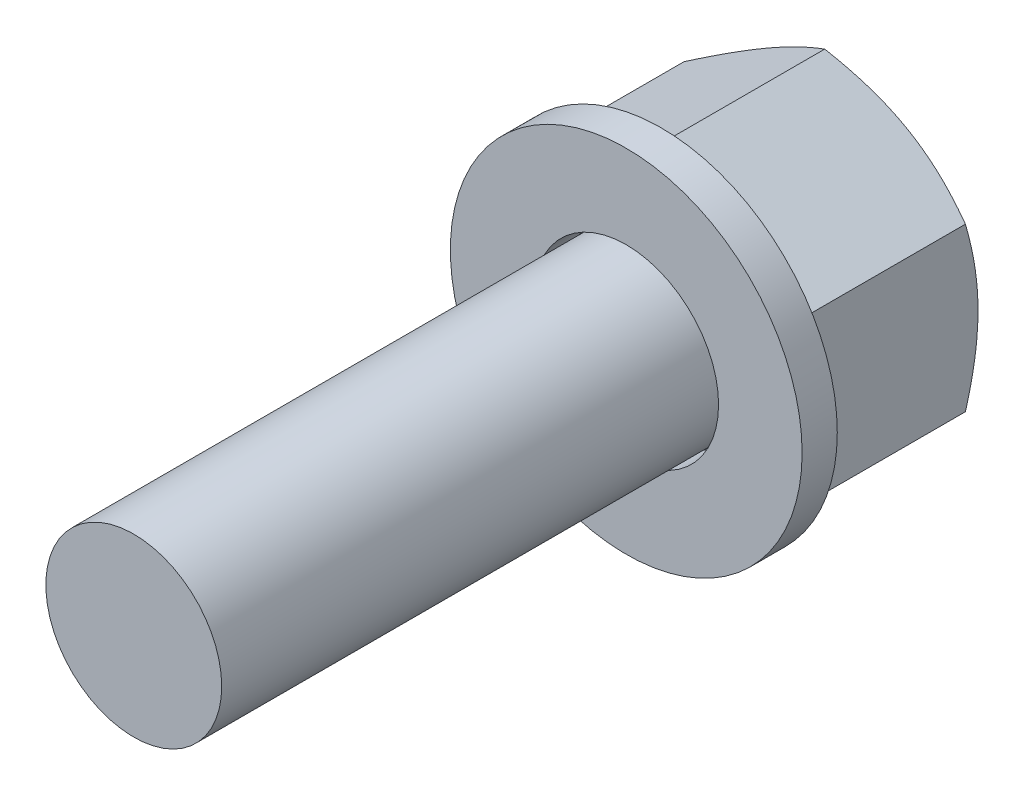
ISO-10303-21;
HEADER;
FILE_DESCRIPTION(('STEP AP214'),'2;1');
FILE_NAME('part.step','',(''),(''),'','','');
FILE_SCHEMA(('AUTOMOTIVE_DESIGN { 1 0 10303 214 1 1 1 1 }'));
ENDSEC;
DATA;
#1=APPLICATION_CONTEXT('core data for automotive mechanical design processes');
#2=APPLICATION_PROTOCOL_DEFINITION('international standard','automotive_design',2000,#1);
#3=PRODUCT_CONTEXT('',#1,'mechanical');
#4=PRODUCT('Part','Part','',(#3));
#5=PRODUCT_RELATED_PRODUCT_CATEGORY('part','',(#4));
#6=PRODUCT_DEFINITION_FORMATION('','',#4);
#7=PRODUCT_DEFINITION_CONTEXT('part definition',#1,'design');
#8=PRODUCT_DEFINITION('design','',#6,#7);
#9=PRODUCT_DEFINITION_SHAPE('','',#8);
#10=(LENGTH_UNIT() NAMED_UNIT(*) SI_UNIT(.MILLI.,.METRE.));
#11=(NAMED_UNIT(*) PLANE_ANGLE_UNIT() SI_UNIT($,.RADIAN.));
#12=(NAMED_UNIT(*) SI_UNIT($,.STERADIAN.) SOLID_ANGLE_UNIT());
#13=UNCERTAINTY_MEASURE_WITH_UNIT(LENGTH_MEASURE(1.E-05),#10,'distance_accuracy_value','');
#14=(GEOMETRIC_REPRESENTATION_CONTEXT(3) GLOBAL_UNCERTAINTY_ASSIGNED_CONTEXT((#13)) GLOBAL_UNIT_ASSIGNED_CONTEXT((#10,
#11,#12)) REPRESENTATION_CONTEXT('',''));
#15=CARTESIAN_POINT('',(0.,0.,0.));
#16=DIRECTION('',(0.,0.,1.));
#17=DIRECTION('',(1.,0.,0.));
#18=AXIS2_PLACEMENT_3D('',#15,#16,#17);
#19=CARTESIAN_POINT('',(-11.1632104785927,7.53610294902704,12.));
#20=DIRECTION('',(0.,0.,1.));
#21=DIRECTION('',(1.,0.,0.));
#22=AXIS2_PLACEMENT_3D('',#19,#20,#21);
#23=PLANE('',#22);
#24=CARTESIAN_POINT('',(-11.1632104785927,7.53610294902704,12.));
#25=DIRECTION('',(0.,0.,1.));
#26=DIRECTION('',(1.,0.,0.));
#27=AXIS2_PLACEMENT_3D('',#24,#25,#26);
#28=CIRCLE('',#27,10.);
#29=CARTESIAN_POINT('',(-1.16321047859271,7.53610294902704,12.));
#30=VERTEX_POINT('',#29);
#31=EDGE_CURVE('E11',#30,#30,#28,.T.);
#32=ORIENTED_EDGE('',*,*,#31,.T.);
#33=EDGE_LOOP('',(#32));
#34=FACE_BOUND('',#33,.T.);
#35=CARTESIAN_POINT('',(-11.1632104785927,7.53610294902704,12.));
#36=DIRECTION('',(0.,0.,1.));
#37=DIRECTION('',(1.,0.,0.));
#38=AXIS2_PLACEMENT_3D('',#35,#36,#37);
#39=CIRCLE('',#38,5.25);
#40=CARTESIAN_POINT('',(-5.91321047859271,7.53610294902704,12.));
#41=VERTEX_POINT('',#40);
#42=EDGE_CURVE('E60',#41,#41,#39,.T.);
#43=ORIENTED_EDGE('',*,*,#42,.F.);
#44=EDGE_LOOP('',(#43));
#45=FACE_BOUND('',#44,.T.);
#46=ADVANCED_FACE('F49',(#34,#45),#23,.T.);
#47=CARTESIAN_POINT('',(-11.1632104785927,7.53610294902704,10.));
#48=DIRECTION('',(0.,0.,1.));
#49=DIRECTION('',(1.,0.,0.));
#50=AXIS2_PLACEMENT_3D('',#47,#48,#49);
#51=PLANE('',#50);
#52=CARTESIAN_POINT('',(-11.1632104785927,7.53610294902704,10.));
#53=DIRECTION('',(0.,0.,1.));
#54=DIRECTION('',(1.,0.,0.));
#55=AXIS2_PLACEMENT_3D('',#52,#53,#54);
#56=CIRCLE('',#55,10.);
#57=CARTESIAN_POINT('',(-1.16321047859271,7.53610294902704,10.));
#58=VERTEX_POINT('',#57);
#59=EDGE_CURVE('E53',#58,#58,#56,.T.);
#60=ORIENTED_EDGE('',*,*,#59,.F.);
#61=EDGE_LOOP('',(#60));
#62=FACE_BOUND('',#61,.T.);
#63=CARTESIAN_POINT('',(-11.1632104785927,7.53610294902704,10.));
#64=DIRECTION('',(0.,0.,1.));
#65=DIRECTION('',(1.,0.,0.));
#66=AXIS2_PLACEMENT_3D('',#63,#64,#65);
#67=CIRCLE('',#66,5.25);
#68=CARTESIAN_POINT('',(-5.91321047859271,7.53610294902704,10.));
#69=VERTEX_POINT('',#68);
#70=EDGE_CURVE('E62',#69,#69,#67,.T.);
#71=ORIENTED_EDGE('',*,*,#70,.T.);
#72=EDGE_LOOP('',(#71));
#73=FACE_BOUND('',#72,.T.);
#74=ADVANCED_FACE('F72',(#62,#73),#51,.F.);
#75=CARTESIAN_POINT('',(-11.1632104785927,7.53610294902704,12.));
#76=DIRECTION('',(0.,0.,-1.));
#77=DIRECTION('',(-1.,0.,0.));
#78=AXIS2_PLACEMENT_3D('',#75,#76,#77);
#79=CYLINDRICAL_SURFACE('',#78,10.);
#80=ORIENTED_EDGE('',*,*,#31,.F.);
#81=EDGE_LOOP('',(#80));
#82=FACE_BOUND('',#81,.T.);
#83=ORIENTED_EDGE('',*,*,#59,.T.);
#84=EDGE_LOOP('',(#83));
#85=FACE_BOUND('',#84,.T.);
#86=ADVANCED_FACE('F51',(#82,#85),#79,.T.);
#87=CARTESIAN_POINT('',(-11.1632104785927,7.53610294902704,12.));
#88=DIRECTION('',(0.,0.,-1.));
#89=DIRECTION('',(-1.,0.,0.));
#90=AXIS2_PLACEMENT_3D('',#87,#88,#89);
#91=CYLINDRICAL_SURFACE('',#90,5.25);
#92=ORIENTED_EDGE('',*,*,#42,.T.);
#93=EDGE_LOOP('',(#92));
#94=FACE_BOUND('',#93,.T.);
#95=ORIENTED_EDGE('',*,*,#70,.F.);
#96=EDGE_LOOP('',(#95));
#97=FACE_BOUND('',#96,.T.);
#98=ADVANCED_FACE('F68',(#94,#97),#91,.F.);
#99=CLOSED_SHELL('',(#46,#74,#86,#98));
#100=MANIFOLD_SOLID_BREP('B2',#99);
#101=CARTESIAN_POINT('',(-2.0540309193443,3.55768591262174,10.));
#102=DIRECTION('',(-0.5,0.866025403784439,0.));
#103=DIRECTION('',(-0.866025403784439,-0.5,0.));
#104=AXIS2_PLACEMENT_3D('',#101,#102,#103);
#105=PLANE('',#104);
#106=CARTESIAN_POINT('',(-3.16301047859271,2.91741626556387,0.714597847732983));
#107=CARTESIAN_POINT('',(-3.33885926247261,2.81588992285415,0.655990714047307));
#108=CARTESIAN_POINT('',(-3.51536367289885,2.7139850539814,0.600043401047298));
#109=CARTESIAN_POINT('',(-3.86980594147117,2.50934771480899,0.494201005024673));
#110=CARTESIAN_POINT('',(-4.04774438328543,2.40661490752835,0.444308534431073));
#111=CARTESIAN_POINT('',(-4.58440871621536,2.09677161044678,0.304692797206872));
#112=CARTESIAN_POINT('',(-4.94525306082844,1.88843803094886,0.225281170978374));
#113=CARTESIAN_POINT('',(-5.48524964879677,1.57667085552387,0.132161646294492));
#114=CARTESIAN_POINT('',(-5.662788668236,1.47416865485897,0.105634581029127));
#115=CARTESIAN_POINT('',(-6.01866959155292,1.26870070798249,0.0611531748588778));
#116=CARTESIAN_POINT('',(-6.19701142308596,1.16573500353912,0.0431980765145818));
#117=CARTESIAN_POINT('',(-6.55400216341631,0.959626303511187,0.0163156484918668));
#118=CARTESIAN_POINT('',(-6.73265049220222,0.856483642796366,0.00737807354623517));
#119=CARTESIAN_POINT('',(-7.0901121836901,0.650103038990858,-0.00127769603486791));
#120=CARTESIAN_POINT('',(-7.26892554112279,0.546865098942398,-0.000996175497148033));
#121=CARTESIAN_POINT('',(-7.60322384560962,0.353857882857286,0.00814502526877787));
#122=CARTESIAN_POINT('',(-7.75873238293139,0.264074986973279,0.015889604367372));
#123=CARTESIAN_POINT('',(-8.06938524033323,0.0847194761278015,0.0382011348534302));
#124=CARTESIAN_POINT('',(-8.22452953515272,-0.00485312424946415,0.0527685461381488));
#125=CARTESIAN_POINT('',(-8.68936179448754,-0.273224154304442,0.106360690527536));
#126=CARTESIAN_POINT('',(-8.99822696577444,-0.451547544090235,0.155268641669145));
#127=CARTESIAN_POINT('',(-9.61923370735301,-0.810085953509199,0.277539403234315));
#128=CARTESIAN_POINT('',(-9.93129602070719,-0.990255214128171,0.351420520376001));
#129=CARTESIAN_POINT('',(-10.5507669602875,-1.34790692785,0.519100141254974));
#130=CARTESIAN_POINT('',(-10.8581835194845,-1.52539396105573,0.612859260854458));
#131=CARTESIAN_POINT('',(-11.1634104785927,-1.7016168280608,0.714597847732978));
#132=B_SPLINE_CURVE_WITH_KNOTS('',3,(#106,#107,#108,#109,#110,#111,#112,#113,#114,#115,#116,
#117,#118,#119,#120,#121,#122,#123,#124,#125,#126,#127,#128,#129,#130,#131),.UNSPECIFIED.,.F.,
.F.,(4,2,2,2,2,2,2,2,2,2,2,2,4),(0.,0.633973543721352,1.26821965714356,2.53934712434766,
3.15934343977049,3.77928496069784,4.39852133866767,5.01773858515596,5.55680239410249,
6.09590254421148,7.17487077411835,8.27776850154292,9.37850115249054),.UNSPECIFIED.);
#133=CARTESIAN_POINT('',(-3.16321047859271,2.91730079551004,0.714531179816332));
#134=VERTEX_POINT('',#133);
#135=CARTESIAN_POINT('',(-7.16321047859272,0.60789971875153,0.));
#136=VERTEX_POINT('',#135);
#137=EDGE_CURVE('E192',#134,#136,#132,.T.);
#138=ORIENTED_EDGE('',*,*,#137,.F.);
#139=DIRECTION('',(0.,0.,-1.));
#140=VECTOR('',#139,1.);
#141=CARTESIAN_POINT('',(-3.16321047859271,2.91730079551004,10.));
#142=LINE('',#141,#140);
#143=CARTESIAN_POINT('',(-3.16321047859271,2.91730079551004,10.));
#144=VERTEX_POINT('',#143);
#145=EDGE_CURVE('E209',#144,#134,#142,.T.);
#146=ORIENTED_EDGE('',*,*,#145,.F.);
#147=DIRECTION('',(0.866025403784439,0.5,0.));
#148=VECTOR('',#147,1.);
#149=CARTESIAN_POINT('',(-2.0540309193443,3.55768591262174,10.));
#150=LINE('',#149,#148);
#151=CARTESIAN_POINT('',(-11.1632104785927,-1.70150135800697,10.));
#152=VERTEX_POINT('',#151);
#153=EDGE_CURVE('E262',#152,#144,#150,.T.);
#154=ORIENTED_EDGE('',*,*,#153,.F.);
#155=DIRECTION('',(0.,0.,-1.));
#156=VECTOR('',#155,1.);
#157=CARTESIAN_POINT('',(-11.1632104785927,-1.70150135800697,10.));
#158=LINE('',#157,#156);
#159=CARTESIAN_POINT('',(-11.1632104785927,-1.70150135800697,0.714531179816329));
#160=VERTEX_POINT('',#159);
#161=EDGE_CURVE('E277',#152,#160,#158,.T.);
#162=ORIENTED_EDGE('',*,*,#161,.T.);
#163=EDGE_CURVE('E298',#136,#160,#132,.T.);
#164=ORIENTED_EDGE('',*,*,#163,.F.);
#165=EDGE_LOOP('',(#138,#146,#154,#162,#164));
#166=FACE_BOUND('',#165,.T.);
#167=ADVANCED_FACE('F110',(#166),#105,.F.);
#168=CARTESIAN_POINT('',(-3.16321047859271,0.,10.));
#169=DIRECTION('',(-1.,0.,0.));
#170=DIRECTION('',(0.,0.,1.));
#171=AXIS2_PLACEMENT_3D('',#168,#169,#170);
#172=PLANE('',#171);
#173=CARTESIAN_POINT('',(-3.16321047859271,-4.97682620943437,3.95583867714707));
#174=CARTESIAN_POINT('',(-3.16321047859271,-4.62646107555689,3.78545562620078));
#175=CARTESIAN_POINT('',(-3.16321047859271,-4.27530289010461,3.61667599394854));
#176=CARTESIAN_POINT('',(-3.16321047859271,-3.57097896554717,3.2832234371504));
#177=CARTESIAN_POINT('',(-3.16321047859271,-3.21781292977735,3.11855113991346));
#178=CARTESIAN_POINT('',(-3.16321047859271,-2.50728328800546,2.79340753111619));
#179=CARTESIAN_POINT('',(-3.16321047859271,-2.14990735946823,2.63296305642341));
#180=CARTESIAN_POINT('',(-3.16321047859271,-1.43234952569936,2.31850098427352));
#181=CARTESIAN_POINT('',(-3.16321047859271,-1.0721677510108,2.16448308991153));
#182=CARTESIAN_POINT('',(-3.16321047859271,-0.336495143481326,1.85962396171519));
#183=CARTESIAN_POINT('',(-3.16321047859271,0.0391090129986439,1.70905471064825));
#184=CARTESIAN_POINT('',(-3.16321047859271,0.794671012477403,1.4190566418621));
#185=CARTESIAN_POINT('',(-3.16321047859271,1.17462933272836,1.27962905897736));
#186=CARTESIAN_POINT('',(-3.16321047859271,1.93883180449096,1.01549651955411));
#187=CARTESIAN_POINT('',(-3.16321047859271,2.32306586686865,0.89076268123599));
#188=CARTESIAN_POINT('',(-3.16321047859271,3.09703073594591,0.659947891390958));
#189=CARTESIAN_POINT('',(-3.16321047859271,3.48675980449369,0.5538611784085));
#190=CARTESIAN_POINT('',(-3.16321047859271,4.269866719254,0.365924175439379));
#191=CARTESIAN_POINT('',(-3.16321047859271,4.66321194450826,0.283941586460917));
#192=CARTESIAN_POINT('',(-3.16321047859271,5.2568947171314,0.182551501549597));
#193=CARTESIAN_POINT('',(-3.16321047859271,5.45541327671288,0.152350800716321));
#194=CARTESIAN_POINT('',(-3.16321047859271,5.85347286144641,0.0997336052582475));
#195=CARTESIAN_POINT('',(-3.16321047859271,6.05301378556852,0.0773163559748541));
#196=CARTESIAN_POINT('',(-3.16321047859271,6.45019614805782,0.0409996259359649));
#197=CARTESIAN_POINT('',(-3.16321047859271,6.64782754817885,0.0269908135266279));
#198=CARTESIAN_POINT('',(-3.16321047859271,7.04350600835748,0.0073483726413162));
#199=CARTESIAN_POINT('',(-3.16321047859271,7.24155306130159,0.00171460198648287));
#200=CARTESIAN_POINT('',(-3.16321047859271,7.63770952038498,-0.0010429673494914));
#201=CARTESIAN_POINT('',(-3.16321047859271,7.83581892699747,0.001833300192532));
#202=CARTESIAN_POINT('',(-3.16321047859271,8.23173764263204,0.0160242569427389));
#203=CARTESIAN_POINT('',(-3.16321047859271,8.42954693690987,0.0273393480972802));
#204=CARTESIAN_POINT('',(-3.16321047859271,8.90167009585454,0.0641744778736273));
#205=CARTESIAN_POINT('',(-3.16321047859271,9.17569236972895,0.0935162888707967));
#206=CARTESIAN_POINT('',(-3.16321047859271,9.72176022753417,0.166817992454415));
#207=CARTESIAN_POINT('',(-3.16321047859271,9.99380555085057,0.210779777858929));
#208=CARTESIAN_POINT('',(-3.16321047859271,10.806625293464,0.362268610049229));
#209=CARTESIAN_POINT('',(-3.16321047859271,11.3438022362609,0.489374232972776));
#210=CARTESIAN_POINT('',(-3.16321047859271,12.147344764835,0.710560343034664));
#211=CARTESIAN_POINT('',(-3.16321047859271,12.4178547243446,0.790456740492547));
#212=CARTESIAN_POINT('',(-3.16321047859271,12.9562482384914,0.958735317999197));
#213=CARTESIAN_POINT('',(-3.16321047859271,13.2241317736444,1.04711756094802));
#214=CARTESIAN_POINT('',(-3.16321047859271,13.7573558093438,1.23093400072742));
#215=CARTESIAN_POINT('',(-3.16321047859271,14.0226970489688,1.32636607318942));
#216=CARTESIAN_POINT('',(-3.16321047859271,14.5511658268171,1.5231404013429));
#217=CARTESIAN_POINT('',(-3.16321047859271,14.8142934095011,1.62448253800637));
#218=CARTESIAN_POINT('',(-3.16321047859271,15.5036822763205,1.89747002443615));
#219=CARTESIAN_POINT('',(-3.16321047859271,15.928325027106,2.07319821098395));
#220=CARTESIAN_POINT('',(-3.16321047859271,16.773413945882,2.43450500202877));
#221=CARTESIAN_POINT('',(-3.16321047859271,17.1938596989216,2.62008456927881));
#222=CARTESIAN_POINT('',(-3.16321047859271,18.0314810660595,2.99883432595372));
#223=CARTESIAN_POINT('',(-3.16321047859271,18.4486555088375,3.1920070975434));
#224=CARTESIAN_POINT('',(-3.16321047859271,19.2802271333456,3.58418474211925));
#225=CARTESIAN_POINT('',(-3.16321047859271,19.6946244131227,3.78318940786502));
#226=CARTESIAN_POINT('',(-3.16321047859271,20.521786035865,4.18609465848904));
#227=CARTESIAN_POINT('',(-3.16321047859271,20.934547056624,4.39000205005959));
#228=CARTESIAN_POINT('',(-3.16321047859271,21.7582295738011,4.8015003999014));
#229=CARTESIAN_POINT('',(-3.16321047859271,22.1691510568904,5.00909138480925));
#230=CARTESIAN_POINT('',(-3.16321047859271,22.9893929493316,5.42721038320668));
#231=CARTESIAN_POINT('',(-3.16321047859271,23.3987136591581,5.6377378079254));
#232=CARTESIAN_POINT('',(-3.16321047859271,24.2160906622184,6.06123442899081));
#233=CARTESIAN_POINT('',(-3.16321047859271,24.624146950439,6.27420363500302));
#234=CARTESIAN_POINT('',(-3.16321047859271,25.7644142952693,6.87290664968607));
#235=CARTESIAN_POINT('',(-3.16321047859271,26.4954463236679,7.26088561150215));
#236=CARTESIAN_POINT('',(-3.16321047859271,27.9550154922266,8.04159320516506));
#237=CARTESIAN_POINT('',(-3.16321047859271,28.6835524931106,8.43432209678816));
#238=CARTESIAN_POINT('',(-3.16321047859271,30.1364115194762,9.22210229728399));
#239=CARTESIAN_POINT('',(-3.16321047859271,30.8607395975913,9.61714245087919));
#240=CARTESIAN_POINT('',(-3.16321047859271,31.9460847341197,10.2117322144822));
#241=CARTESIAN_POINT('',(-3.16321047859271,32.3076623828794,10.4102599275219));
#242=CARTESIAN_POINT('',(-3.16321047859271,33.0304833920339,10.8079218150819));
#243=CARTESIAN_POINT('',(-3.16321047859271,33.391726752903,11.0070559887402));
#244=CARTESIAN_POINT('',(-3.16321047859271,33.7528231671495,11.2064563382666));
#245=B_SPLINE_CURVE_WITH_KNOTS('',3,(#173,#174,#175,#176,#177,#178,#179,#180,#181,#182,#183,
#184,#185,#186,#187,#188,#189,#190,#191,#192,#193,#194,#195,#196,#197,#198,#199,#200,#201,#202,
#203,#204,#205,#206,#207,#208,#209,#210,#211,#212,#213,#214,#215,#216,#217,#218,#219,#220,#221,
#222,#223,#224,#225,#226,#227,#228,#229,#230,#231,#232,#233,#234,#235,#236,#237,#238,#239,#240,
#241,#242,#243,#244),.UNSPECIFIED.,.F.,.F.,(4,2,2,2,2,2,2,2,2,2,2,2,2,2,2,2,2,2,2,2,2,2,2,2,2,2,
2,2,2,2,2,2,2,2,2,4),(0.,1.16880588047795,2.3377891917305,3.51295749611108,4.68807144803918,
5.90191370960454,7.11589031562683,8.32743946232026,9.53861361267913,10.7430103426782,
11.3452897554481,11.9475107568131,12.5417214039076,13.1359219632724,13.7301271465819,
14.3243606340572,15.1506623887472,15.9770711647035,17.6307319451341,18.4768449347359,
19.3229641965072,20.1688295238942,21.014677821533,22.3931966367318,23.7718504203478,
25.1509771588064,26.5300549483226,27.9111726944925,29.2923004317938,30.6731551171407,
32.0540152703407,34.5368130414091,37.0197472176366,39.4948897838097,40.7323726306587,
41.969853719233),.UNSPECIFIED.);
#246=CARTESIAN_POINT('',(-3.16321047859271,12.1549051025441,0.714531179816331));
#247=VERTEX_POINT('',#246);
#248=CARTESIAN_POINT('',(-3.16321047859271,7.53610294902704,0.));
#249=VERTEX_POINT('',#248);
#250=EDGE_CURVE('E181',#247,#249,#245,.F.);
#251=ORIENTED_EDGE('',*,*,#250,.F.);
#252=DIRECTION('',(0.,0.,-1.));
#253=VECTOR('',#252,1.);
#254=CARTESIAN_POINT('',(-3.16321047859271,12.1549051025441,10.));
#255=LINE('',#254,#253);
#256=CARTESIAN_POINT('',(-3.16321047859271,12.1549051025441,10.));
#257=VERTEX_POINT('',#256);
#258=EDGE_CURVE('E289',#257,#247,#255,.T.);
#259=ORIENTED_EDGE('',*,*,#258,.F.);
#260=DIRECTION('',(0.,1.,0.));
#261=VECTOR('',#260,1.);
#262=CARTESIAN_POINT('',(-3.16321047859271,0.,10.));
#263=LINE('',#262,#261);
#264=EDGE_CURVE('E267',#144,#257,#263,.T.);
#265=ORIENTED_EDGE('',*,*,#264,.F.);
#266=ORIENTED_EDGE('',*,*,#145,.T.);
#267=EDGE_CURVE('E193',#249,#134,#245,.F.);
#268=ORIENTED_EDGE('',*,*,#267,.F.);
#269=EDGE_LOOP('',(#251,#259,#265,#266,#268));
#270=FACE_BOUND('',#269,.T.);
#271=ADVANCED_FACE('F207',(#270),#172,.F.);
#272=CARTESIAN_POINT('',(4.47242568004794,7.74646851091882,10.));
#273=DIRECTION('',(-0.5,-0.866025403784438,0.));
#274=DIRECTION('',(0.866025403784438,-0.5,0.));
#275=AXIS2_PLACEMENT_3D('',#272,#273,#274);
#276=PLANE('',#275);
#277=CARTESIAN_POINT('',(-11.1634104785927,16.7738227261149,0.714597847732982));
#278=CARTESIAN_POINT('',(-10.9875616947128,16.6722963834052,0.655990714047306));
#279=CARTESIAN_POINT('',(-10.8110572842866,16.5703915145324,0.600043401047298));
#280=CARTESIAN_POINT('',(-10.4566150157142,16.36575417536,0.494201005024673));
#281=CARTESIAN_POINT('',(-10.2786765739,16.2630213680794,0.444308534431073));
#282=CARTESIAN_POINT('',(-9.74201224097006,15.9531780709978,0.304692797206871));
#283=CARTESIAN_POINT('',(-9.38116789635698,15.7448444914999,0.225281170978373));
#284=CARTESIAN_POINT('',(-8.84117130838865,15.4330773160749,0.132161646294491));
#285=CARTESIAN_POINT('',(-8.66363228894942,15.33057511541,0.105634581029126));
#286=CARTESIAN_POINT('',(-8.30775136563251,15.1251071685335,0.0611531748588778));
#287=CARTESIAN_POINT('',(-8.12940953409947,15.0221414640901,0.0431980765145827));
#288=CARTESIAN_POINT('',(-7.77241879376911,14.8160327640622,0.016315648491868));
#289=CARTESIAN_POINT('',(-7.5937704649832,14.7128901033474,0.00737807354623586));
#290=CARTESIAN_POINT('',(-7.23630877349532,14.5065094995419,-0.0012776960348678));
#291=CARTESIAN_POINT('',(-7.05749541606264,14.4032715594934,-0.000996175497147963));
#292=CARTESIAN_POINT('',(-6.7231971115758,14.2102643434083,0.00814502526877788));
#293=CARTESIAN_POINT('',(-6.56768857425403,14.1204814475243,0.015889604367372));
#294=CARTESIAN_POINT('',(-6.25703571685219,13.9411259366788,0.0382011348534311));
#295=CARTESIAN_POINT('',(-6.10189142203271,13.8515533363016,0.0527685461381507));
#296=CARTESIAN_POINT('',(-5.63705916269789,13.5831823062466,0.10636069052754));
#297=CARTESIAN_POINT('',(-5.32819399141099,13.4048589164608,0.155268641669148));
#298=CARTESIAN_POINT('',(-4.70718724983241,13.0463205070418,0.277539403234317));
#299=CARTESIAN_POINT('',(-4.39512493647823,12.8661512464228,0.351420520376003));
#300=CARTESIAN_POINT('',(-3.77565399689795,12.508499532701,0.519100141254976));
#301=CARTESIAN_POINT('',(-3.46823743770096,12.3310124994953,0.612859260854461));
#302=CARTESIAN_POINT('',(-3.16301047859271,12.1547896324902,0.714597847732983));
#303=B_SPLINE_CURVE_WITH_KNOTS('',3,(#277,#278,#279,#280,#281,#282,#283,#284,#285,#286,#287,
#288,#289,#290,#291,#292,#293,#294,#295,#296,#297,#298,#299,#300,#301,#302),.UNSPECIFIED.,.F.,
.F.,(4,2,2,2,2,2,2,2,2,2,2,2,4),(0.,0.633973543721354,1.26821965714356,2.53934712434766,
3.15934343977049,3.77928496069784,4.39852133866766,5.01773858515596,5.55680239410249,
6.09590254421148,7.17487077411835,8.27776850154292,9.37850115249054),.UNSPECIFIED.);
#304=CARTESIAN_POINT('',(-11.1632104785927,16.7737072560611,0.714531179816329));
#305=VERTEX_POINT('',#304);
#306=CARTESIAN_POINT('',(-7.16321047859271,14.4643061793026,0.));
#307=VERTEX_POINT('',#306);
#308=EDGE_CURVE('E126',#305,#307,#303,.T.);
#309=ORIENTED_EDGE('',*,*,#308,.F.);
#310=DIRECTION('',(0.,0.,-1.));
#311=VECTOR('',#310,1.);
#312=CARTESIAN_POINT('',(-11.1632104785927,16.7737072560611,10.));
#313=LINE('',#312,#311);
#314=CARTESIAN_POINT('',(-11.1632104785927,16.7737072560611,10.));
#315=VERTEX_POINT('',#314);
#316=EDGE_CURVE('E286',#315,#305,#313,.T.);
#317=ORIENTED_EDGE('',*,*,#316,.F.);
#318=DIRECTION('',(-0.866025403784439,0.5,0.));
#319=VECTOR('',#318,1.);
#320=CARTESIAN_POINT('',(4.47242568004794,7.74646851091882,10.));
#321=LINE('',#320,#319);
#322=EDGE_CURVE('E269',#257,#315,#321,.T.);
#323=ORIENTED_EDGE('',*,*,#322,.F.);
#324=ORIENTED_EDGE('',*,*,#258,.T.);
#325=EDGE_CURVE('E187',#307,#247,#303,.T.);
#326=ORIENTED_EDGE('',*,*,#325,.F.);
#327=EDGE_LOOP('',(#309,#317,#323,#324,#326));
#328=FACE_BOUND('',#327,.T.);
#329=ADVANCED_FACE('F232',(#328),#276,.F.);
#330=CARTESIAN_POINT('',(-10.0540309193443,17.4140923731728,10.));
#331=DIRECTION('',(0.5,-0.866025403784439,0.));
#332=DIRECTION('',(0.866025403784439,0.5,0.));
#333=AXIS2_PLACEMENT_3D('',#330,#331,#332);
#334=PLANE('',#333);
#335=CARTESIAN_POINT('',(-19.1634104785927,12.1547896324902,0.714597847732976));
#336=CARTESIAN_POINT('',(-18.9875616947128,12.2563159751999,0.6559907140473));
#337=CARTESIAN_POINT('',(-18.8110572842866,12.3582208440727,0.600043401047293));
#338=CARTESIAN_POINT('',(-18.4566150157142,12.5628581832451,0.494201005024668));
#339=CARTESIAN_POINT('',(-18.2786765739,12.6655909905257,0.444308534431067));
#340=CARTESIAN_POINT('',(-17.7420122409701,12.9754342876073,0.304692797206865));
#341=CARTESIAN_POINT('',(-17.381167896357,13.1837678671052,0.225281170978367));
#342=CARTESIAN_POINT('',(-16.8411713083887,13.4955350425302,0.132161646294486));
#343=CARTESIAN_POINT('',(-16.6636322889494,13.5980372431951,0.105634581029121));
#344=CARTESIAN_POINT('',(-16.3077513656325,13.8035051900716,0.0611531748588727));
#345=CARTESIAN_POINT('',(-16.1294095340995,13.906470894515,0.0431980765145776));
#346=CARTESIAN_POINT('',(-15.7724187937691,14.1125795945429,0.0163156484918625));
#347=CARTESIAN_POINT('',(-15.5937704649832,14.2157222552577,0.00737807354622994));
#348=CARTESIAN_POINT('',(-15.2363087734953,14.4221028590632,-0.00127769603487356));
#349=CARTESIAN_POINT('',(-15.0574954160626,14.5253407991117,-0.000996175497153116));
#350=CARTESIAN_POINT('',(-14.7231971115758,14.7183480151968,0.00814502526877374));
#351=CARTESIAN_POINT('',(-14.567688574254,14.8081309110808,0.0158896043673683));
#352=CARTESIAN_POINT('',(-14.2570357168522,14.9874864219263,0.0382011348534272));
#353=CARTESIAN_POINT('',(-14.1018914220327,15.0770590223035,0.0527685461381461));
#354=CARTESIAN_POINT('',(-13.6370591626979,15.3454300523585,0.106360690527534));
#355=CARTESIAN_POINT('',(-13.328193991411,15.5237534421443,0.155268641669143));
#356=CARTESIAN_POINT('',(-12.7071872498324,15.8822918515633,0.277539403234314));
#357=CARTESIAN_POINT('',(-12.3951249364782,16.0624611121823,0.351420520376001));
#358=CARTESIAN_POINT('',(-11.7756539968979,16.4201128259041,0.519100141254976));
#359=CARTESIAN_POINT('',(-11.468237437701,16.5975998591098,0.61285926085446));
#360=CARTESIAN_POINT('',(-11.1630104785927,16.7738227261149,0.714597847732981));
#361=B_SPLINE_CURVE_WITH_KNOTS('',3,(#335,#336,#337,#338,#339,#340,#341,#342,#343,#344,#345,
#346,#347,#348,#349,#350,#351,#352,#353,#354,#355,#356,#357,#358,#359,#360),.UNSPECIFIED.,.F.,
.F.,(4,2,2,2,2,2,2,2,2,2,2,2,4),(0.,0.633973543721349,1.26821965714356,2.53934712434766,
3.15934343977049,3.77928496069784,4.39852133866766,5.01773858515595,5.55680239410249,
6.09590254421148,7.17487077411835,8.27776850154293,9.37850115249055),.UNSPECIFIED.);
#362=CARTESIAN_POINT('',(-19.1632104785927,12.1549051025441,0.714531179816324));
#363=VERTEX_POINT('',#362);
#364=CARTESIAN_POINT('',(-15.1632104785927,14.4643061793025,0.));
#365=VERTEX_POINT('',#364);
#366=EDGE_CURVE('E133',#363,#365,#361,.T.);
#367=ORIENTED_EDGE('',*,*,#366,.F.);
#368=DIRECTION('',(0.,0.,-1.));
#369=VECTOR('',#368,1.);
#370=CARTESIAN_POINT('',(-19.1632104785927,12.1549051025441,10.));
#371=LINE('',#370,#369);
#372=CARTESIAN_POINT('',(-19.1632104785927,12.1549051025441,10.));
#373=VERTEX_POINT('',#372);
#374=EDGE_CURVE('E283',#373,#363,#371,.T.);
#375=ORIENTED_EDGE('',*,*,#374,.F.);
#376=DIRECTION('',(-0.866025403784439,-0.5,0.));
#377=VECTOR('',#376,1.);
#378=CARTESIAN_POINT('',(-10.0540309193443,17.4140923731728,10.));
#379=LINE('',#378,#377);
#380=EDGE_CURVE('E271',#315,#373,#379,.T.);
#381=ORIENTED_EDGE('',*,*,#380,.F.);
#382=ORIENTED_EDGE('',*,*,#316,.T.);
#383=EDGE_CURVE('E252',#365,#305,#361,.T.);
#384=ORIENTED_EDGE('',*,*,#383,.F.);
#385=EDGE_LOOP('',(#367,#375,#381,#382,#384));
#386=FACE_BOUND('',#385,.T.);
#387=ADVANCED_FACE('F236',(#386),#334,.F.);
#388=CARTESIAN_POINT('',(-19.1632104785927,0.,10.));
#389=DIRECTION('',(1.,0.,0.));
#390=DIRECTION('',(0.,1.,0.));
#391=AXIS2_PLACEMENT_3D('',#388,#389,#390);
#392=PLANE('',#391);
#393=CARTESIAN_POINT('',(-19.1632104785927,-4.97682621179257,3.95583867829417));
#394=CARTESIAN_POINT('',(-19.1632104785927,-4.62646107783575,3.78545562729998));
#395=CARTESIAN_POINT('',(-19.1632104785927,-4.27530289230407,3.61667599499987));
#396=CARTESIAN_POINT('',(-19.1632104785927,-3.57097896758758,3.28322343810621));
#397=CARTESIAN_POINT('',(-19.1632104785927,-3.21781293173812,3.11855114082163));
#398=CARTESIAN_POINT('',(-19.1632104785927,-2.50728328980571,2.79340753192904));
#399=CARTESIAN_POINT('',(-19.1632104785927,-2.14990736118761,2.6329630571886));
#400=CARTESIAN_POINT('',(-19.1632104785927,-1.43234952725643,2.31850098494418));
#401=CARTESIAN_POINT('',(-19.1632104785927,-1.07216775248645,2.16448309053532));
#402=CARTESIAN_POINT('',(-19.1632104785927,-0.336495144787907,1.85962396224393));
#403=CARTESIAN_POINT('',(-19.1632104785927,0.0391090117797563,1.70905471112892));
#404=CARTESIAN_POINT('',(-19.1632104785927,0.794671011435317,1.41905664224921));
#405=CARTESIAN_POINT('',(-19.1632104785927,1.17462933177538,1.27962905931898));
#406=CARTESIAN_POINT('',(-19.1632104785927,1.93883180371785,1.0154965198091));
#407=CARTESIAN_POINT('',(-19.1632104785927,2.32306586618631,0.89076268144983));
#408=CARTESIAN_POINT('',(-19.1632104785927,3.09703073544754,0.659947891529227));
#409=CARTESIAN_POINT('',(-19.1632104785927,3.48675980408854,0.553861178512341));
#410=CARTESIAN_POINT('',(-19.1632104785927,4.2698667190833,0.365924175473776));
#411=CARTESIAN_POINT('',(-19.1632104785927,4.66321194447946,0.283941586462977));
#412=CARTESIAN_POINT('',(-19.1632104785927,5.25689471731793,0.182551501519162));
#413=CARTESIAN_POINT('',(-19.1632104785927,5.45541327697159,0.152350800677727));
#414=CARTESIAN_POINT('',(-19.1632104785927,5.85347286185006,0.0997336052092711));
#415=CARTESIAN_POINT('',(-19.1632104785927,6.05301378604495,0.0773163559236545));
#416=CARTESIAN_POINT('',(-19.1632104785927,6.4501961486783,0.0409996258867514));
#417=CARTESIAN_POINT('',(-19.1632104785927,6.6478275488706,0.0269908134815067));
#418=CARTESIAN_POINT('',(-19.1632104785927,7.04350600919162,0.0073483726106716));
#419=CARTESIAN_POINT('',(-19.1632104785927,7.24155306220686,0.00171460196622251));
#420=CARTESIAN_POINT('',(-19.1632104785927,7.63770952143196,-0.001042967342838));
#421=CARTESIAN_POINT('',(-19.1632104785927,7.83581892811504,0.00183330021571612));
#422=CARTESIAN_POINT('',(-19.1632104785927,8.23173764388988,0.0160242570046905));
#423=CARTESIAN_POINT('',(-19.1632104785927,8.42954693823738,0.0273393481814692));
#424=CARTESIAN_POINT('',(-19.1632104785927,8.90167009728979,0.0641744780125038));
#425=CARTESIAN_POINT('',(-19.1632104785927,9.17569237120195,0.0935162890411611));
#426=CARTESIAN_POINT('',(-19.1632104785927,9.72176022908099,0.166817992689442));
#427=CARTESIAN_POINT('',(-19.1632104785927,9.99380555243346,0.210779778127131));
#428=CARTESIAN_POINT('',(-19.1632104785927,10.8066252951531,0.362268610417652));
#429=CARTESIAN_POINT('',(-19.1632104785927,11.3438022380181,0.4893742334089));
#430=CARTESIAN_POINT('',(-19.1632104785927,12.147344766694,0.710560343570705));
#431=CARTESIAN_POINT('',(-19.1632104785927,12.4178547262382,0.790456741062126));
#432=CARTESIAN_POINT('',(-19.1632104785927,12.9562482404539,0.958735318634836));
#433=CARTESIAN_POINT('',(-19.1632104785927,13.2241317756411,1.04711756161618));
#434=CARTESIAN_POINT('',(-19.1632104785927,13.7573558114089,1.23093400145946));
#435=CARTESIAN_POINT('',(-19.1632104785927,14.0226970510679,1.32636607395283));
#436=CARTESIAN_POINT('',(-19.1632104785927,14.5511658289842,1.52314040216795));
#437=CARTESIAN_POINT('',(-19.1632104785927,14.8142934117023,1.62448253886171));
#438=CARTESIAN_POINT('',(-19.1632104785927,15.5036822785419,1.89747002534238));
#439=CARTESIAN_POINT('',(-19.1632104785927,15.9283250293146,2.07319821190785));
#440=CARTESIAN_POINT('',(-19.1632104785927,16.7734139480666,2.43450500298305));
#441=CARTESIAN_POINT('',(-19.1632104785927,17.193859701095,2.62008457024582));
#442=CARTESIAN_POINT('',(-19.1632104785927,18.0314810682117,2.99883432694256));
#443=CARTESIAN_POINT('',(-19.1632104785927,18.4486555109796,3.19200709854134));
#444=CARTESIAN_POINT('',(-19.1632104785927,19.2802271354688,3.58418474313283));
#445=CARTESIAN_POINT('',(-19.1632104785927,19.6946244152369,3.78318940888511));
#446=CARTESIAN_POINT('',(-19.1632104785927,20.5217860379617,4.18609465952002));
#447=CARTESIAN_POINT('',(-19.1632104785927,20.934547058712,4.39000205109492));
#448=CARTESIAN_POINT('',(-19.1632104785927,21.7582295758725,4.801500400944));
#449=CARTESIAN_POINT('',(-19.1632104785927,22.1691510589537,5.00909138585476));
#450=CARTESIAN_POINT('',(-19.1632104785927,22.9893929513796,5.42721038425695));
#451=CARTESIAN_POINT('',(-19.1632104785927,23.3987136611987,5.63773780897752));
#452=CARTESIAN_POINT('',(-19.1632104785927,24.2160906642446,6.06123443004578));
#453=CARTESIAN_POINT('',(-19.1632104785927,24.6241469524582,6.274203636059));
#454=CARTESIAN_POINT('',(-19.1632104785927,25.7644142972811,6.87290665075001));
#455=CARTESIAN_POINT('',(-19.1632104785927,26.4954463256794,7.26088561257242));
#456=CARTESIAN_POINT('',(-19.1632104785927,27.9550154942382,8.04159320624669));
#457=CARTESIAN_POINT('',(-19.1632104785927,28.6835524951226,8.43432209787482));
#458=CARTESIAN_POINT('',(-19.1632104785927,30.1364115214913,9.22210229838088));
#459=CARTESIAN_POINT('',(-19.1632104785927,30.8607395996091,9.61714245198128));
#460=CARTESIAN_POINT('',(-19.1632104785927,31.9460847361419,10.2117322155916));
#461=CARTESIAN_POINT('',(-19.1632104785927,32.3076623849031,10.4102599286337));
#462=CARTESIAN_POINT('',(-19.1632104785927,33.0304833940607,10.8079218161984));
#463=CARTESIAN_POINT('',(-19.1632104785927,33.3917267549313,11.007055989859));
#464=CARTESIAN_POINT('',(-19.1632104785927,33.7528231691794,11.2064563393876));
#465=B_SPLINE_CURVE_WITH_KNOTS('',3,(#393,#394,#395,#396,#397,#398,#399,#400,#401,#402,#403,
#404,#405,#406,#407,#408,#409,#410,#411,#412,#413,#414,#415,#416,#417,#418,#419,#420,#421,#422,
#423,#424,#425,#426,#427,#428,#429,#430,#431,#432,#433,#434,#435,#436,#437,#438,#439,#440,#441,
#442,#443,#444,#445,#446,#447,#448,#449,#450,#451,#452,#453,#454,#455,#456,#457,#458,#459,#460,
#461,#462,#463,#464),.UNSPECIFIED.,.F.,.F.,(4,2,2,2,2,2,2,2,2,2,2,2,2,2,2,2,2,2,2,2,2,2,2,2,2,2,
2,2,2,2,2,2,2,2,2,4),(0.,1.16880588075485,2.33778919228436,3.51295749694485,4.68807144915283,
5.90191371101601,7.11589031733622,8.32743946432657,9.53861361498213,10.7430103454166,
11.3452897584042,11.9475107599867,12.5417214072933,13.1359219668704,13.7301271503921,
14.3243606380798,15.1506623928924,15.9770711689713,17.6307319496476,18.4768449393777,
19.3229642012772,20.1688295287922,21.0146778265589,22.3931966417426,23.7718504253434,
25.1509771637862,26.5300549532867,27.9111726994392,29.292300436723,30.6731551220528,
32.0540152752357,34.5368130463123,37.0197472225479,39.4948897887356,40.7323726355921,
41.9698537241738),.UNSPECIFIED.);
#466=CARTESIAN_POINT('',(-19.1632104785927,2.91730079551004,0.714531179816327));
#467=VERTEX_POINT('',#466);
#468=CARTESIAN_POINT('',(-19.1632104785927,7.53610294902705,0.));
#469=VERTEX_POINT('',#468);
#470=EDGE_CURVE('E254',#467,#469,#465,.T.);
#471=ORIENTED_EDGE('',*,*,#470,.F.);
#472=DIRECTION('',(0.,0.,-1.));
#473=VECTOR('',#472,1.);
#474=CARTESIAN_POINT('',(-19.1632104785927,2.91730079551004,10.));
#475=LINE('',#474,#473);
#476=CARTESIAN_POINT('',(-19.1632104785927,2.91730079551004,10.));
#477=VERTEX_POINT('',#476);
#478=EDGE_CURVE('E280',#477,#467,#475,.T.);
#479=ORIENTED_EDGE('',*,*,#478,.F.);
#480=DIRECTION('',(0.,-1.,0.));
#481=VECTOR('',#480,1.);
#482=CARTESIAN_POINT('',(-19.1632104785927,0.,10.));
#483=LINE('',#482,#481);
#484=EDGE_CURVE('E273',#373,#477,#483,.T.);
#485=ORIENTED_EDGE('',*,*,#484,.F.);
#486=ORIENTED_EDGE('',*,*,#374,.T.);
#487=EDGE_CURVE('E253',#469,#363,#465,.T.);
#488=ORIENTED_EDGE('',*,*,#487,.F.);
#489=EDGE_LOOP('',(#471,#479,#485,#486,#488));
#490=FACE_BOUND('',#489,.T.);
#491=ADVANCED_FACE('F241',(#490),#392,.F.);
#492=CARTESIAN_POINT('',(-3.52757431995205,-6.10993794963219,10.));
#493=DIRECTION('',(0.5,0.866025403784439,0.));
#494=DIRECTION('',(-0.866025403784439,0.5,0.));
#495=AXIS2_PLACEMENT_3D('',#492,#493,#494);
#496=PLANE('',#495);
#497=CARTESIAN_POINT('',(-11.1630104785927,-1.70161682806081,0.71459784773298));
#498=CARTESIAN_POINT('',(-11.3388592624726,-1.60009048535108,0.655990714047304));
#499=CARTESIAN_POINT('',(-11.5153636728988,-1.49818561647833,0.600043401047297));
#500=CARTESIAN_POINT('',(-11.8698059414712,-1.29354827730592,0.494201005024672));
#501=CARTESIAN_POINT('',(-12.0477443832854,-1.19081547002528,0.444308534431072));
#502=CARTESIAN_POINT('',(-12.5844087162154,-0.880972172943715,0.304692797206869));
#503=CARTESIAN_POINT('',(-12.9452530608284,-0.672638593445798,0.22528117097837));
#504=CARTESIAN_POINT('',(-13.4852496487968,-0.360871418020804,0.132161646294488));
#505=CARTESIAN_POINT('',(-13.662788668236,-0.258369217355899,0.105634581029123));
#506=CARTESIAN_POINT('',(-14.0186695915529,-0.0529012704794253,0.061153174858874));
#507=CARTESIAN_POINT('',(-14.197011423086,0.0500644339639464,0.0431980765145783));
#508=CARTESIAN_POINT('',(-14.5540021634163,0.25617313399188,0.0163156484918631));
#509=CARTESIAN_POINT('',(-14.7326504922022,0.359315794706701,0.00737807354623095));
#510=CARTESIAN_POINT('',(-15.0901121836901,0.565696398512208,-0.00127769603487305));
#511=CARTESIAN_POINT('',(-15.2689255411228,0.668934338560668,-0.000996175497153522));
#512=CARTESIAN_POINT('',(-15.6032238456096,0.86194155464578,0.00814502526877266));
#513=CARTESIAN_POINT('',(-15.7587323829314,0.951724450529787,0.0158896043673674));
#514=CARTESIAN_POINT('',(-16.0693852403332,1.13107996137526,0.0382011348534259));
#515=CARTESIAN_POINT('',(-16.2245295351527,1.22065256175253,0.0527685461381444));
#516=CARTESIAN_POINT('',(-16.6893617944875,1.48902359180751,0.106360690527532));
#517=CARTESIAN_POINT('',(-16.9982269657744,1.6673469815933,0.155268641669141));
#518=CARTESIAN_POINT('',(-17.619233707353,2.02588539101227,0.277539403234312));
#519=CARTESIAN_POINT('',(-17.9312960207072,2.20605465163124,0.351420520375997));
#520=CARTESIAN_POINT('',(-18.5507669602875,2.56370636535307,0.51910014125497));
#521=CARTESIAN_POINT('',(-18.8581835194845,2.7411933985588,0.612859260854454));
#522=CARTESIAN_POINT('',(-19.1634104785927,2.91741626556388,0.714597847732976));
#523=B_SPLINE_CURVE_WITH_KNOTS('',3,(#497,#498,#499,#500,#501,#502,#503,#504,#505,#506,#507,
#508,#509,#510,#511,#512,#513,#514,#515,#516,#517,#518,#519,#520,#521,#522),.UNSPECIFIED.,.F.,
.F.,(4,2,2,2,2,2,2,2,2,2,2,2,4),(0.,0.633973543721351,1.26821965714356,2.53934712434766,
3.15934343977049,3.77928496069784,4.39852133866766,5.01773858515595,5.55680239410249,
6.09590254421148,7.17487077411835,8.27776850154293,9.37850115249055),.UNSPECIFIED.);
#524=CARTESIAN_POINT('',(-15.1632104785927,0.607899718751538,0.));
#525=VERTEX_POINT('',#524);
#526=EDGE_CURVE('E299',#160,#525,#523,.T.);
#527=ORIENTED_EDGE('',*,*,#526,.F.);
#528=ORIENTED_EDGE('',*,*,#161,.F.);
#529=DIRECTION('',(0.866025403784439,-0.5,0.));
#530=VECTOR('',#529,1.);
#531=CARTESIAN_POINT('',(-3.52757431995205,-6.10993794963219,10.));
#532=LINE('',#531,#530);
#533=EDGE_CURVE('E275',#477,#152,#532,.T.);
#534=ORIENTED_EDGE('',*,*,#533,.F.);
#535=ORIENTED_EDGE('',*,*,#478,.T.);
#536=EDGE_CURVE('E303',#525,#467,#523,.T.);
#537=ORIENTED_EDGE('',*,*,#536,.F.);
#538=EDGE_LOOP('',(#527,#528,#534,#535,#537));
#539=FACE_BOUND('',#538,.T.);
#540=ADVANCED_FACE('F309',(#539),#496,.F.);
#541=CARTESIAN_POINT('',(0.,0.,10.));
#542=DIRECTION('',(0.,0.,1.));
#543=DIRECTION('',(1.,0.,0.));
#544=AXIS2_PLACEMENT_3D('',#541,#542,#543);
#545=PLANE('',#544);
#546=CARTESIAN_POINT('',(-11.1632104785927,7.53610294902704,10.));
#547=DIRECTION('',(0.,0.,1.));
#548=DIRECTION('',(1.,0.,0.));
#549=AXIS2_PLACEMENT_3D('',#546,#547,#548);
#550=CIRCLE('',#549,5.);
#551=CARTESIAN_POINT('',(-6.16321047859271,7.53610294902704,10.));
#552=VERTEX_POINT('',#551);
#553=EDGE_CURVE('E203',#552,#552,#550,.T.);
#554=ORIENTED_EDGE('',*,*,#553,.F.);
#555=EDGE_LOOP('',(#554));
#556=FACE_BOUND('',#555,.T.);
#557=ORIENTED_EDGE('',*,*,#153,.T.);
#558=ORIENTED_EDGE('',*,*,#264,.T.);
#559=ORIENTED_EDGE('',*,*,#322,.T.);
#560=ORIENTED_EDGE('',*,*,#380,.T.);
#561=ORIENTED_EDGE('',*,*,#484,.T.);
#562=ORIENTED_EDGE('',*,*,#533,.T.);
#563=EDGE_LOOP('',(#557,#558,#559,#560,#561,#562));
#564=FACE_BOUND('',#563,.T.);
#565=ADVANCED_FACE('F294',(#556,#564),#545,.T.);
#566=CARTESIAN_POINT('',(-11.1632104785927,7.53610294902704,40.));
#567=DIRECTION('',(0.,0.,-1.));
#568=DIRECTION('',(-1.,0.,0.));
#569=AXIS2_PLACEMENT_3D('',#566,#567,#568);
#570=CYLINDRICAL_SURFACE('',#569,5.);
#571=CARTESIAN_POINT('',(-11.1632104785927,7.53610294902704,40.));
#572=DIRECTION('',(0.,0.,1.));
#573=DIRECTION('',(1.,0.,0.));
#574=AXIS2_PLACEMENT_3D('',#571,#572,#573);
#575=CIRCLE('',#574,5.);
#576=CARTESIAN_POINT('',(-6.16321047859271,7.53610294902704,40.));
#577=VERTEX_POINT('',#576);
#578=EDGE_CURVE('E259',#577,#577,#575,.T.);
#579=ORIENTED_EDGE('',*,*,#578,.F.);
#580=EDGE_LOOP('',(#579));
#581=FACE_BOUND('',#580,.T.);
#582=ORIENTED_EDGE('',*,*,#553,.T.);
#583=EDGE_LOOP('',(#582));
#584=FACE_BOUND('',#583,.T.);
#585=ADVANCED_FACE('F318',(#581,#584),#570,.T.);
#586=CARTESIAN_POINT('',(-11.1632104785927,7.53610294902704,40.));
#587=DIRECTION('',(0.,0.,1.));
#588=DIRECTION('',(1.,0.,0.));
#589=AXIS2_PLACEMENT_3D('',#586,#587,#588);
#590=PLANE('',#589);
#591=ORIENTED_EDGE('',*,*,#578,.T.);
#592=EDGE_LOOP('',(#591));
#593=FACE_BOUND('',#592,.T.);
#594=ADVANCED_FACE('F321',(#593),#590,.T.);
#595=CARTESIAN_POINT('',(-11.1632104785927,7.53610294902704,-1.80384757729335));
#596=DIRECTION('',(0.,0.,1.));
#597=DIRECTION('',(1.,0.,0.));
#598=AXIS2_PLACEMENT_3D('',#595,#596,#597);
#599=CONICAL_SURFACE('',#598,4.87564434701789,1.0471975511966);
#600=ORIENTED_EDGE('',*,*,#137,.T.);
#601=CARTESIAN_POINT('',(-11.1632104785927,7.53610294902704,0.));
#602=DIRECTION('',(0.,0.,1.));
#603=DIRECTION('',(1.,0.,0.));
#604=AXIS2_PLACEMENT_3D('',#601,#602,#603);
#605=CIRCLE('',#604,8.);
#606=EDGE_CURVE('E114',#136,#249,#605,.T.);
#607=ORIENTED_EDGE('',*,*,#606,.T.);
#608=ORIENTED_EDGE('',*,*,#267,.T.);
#609=EDGE_LOOP('',(#600,#607,#608));
#610=FACE_BOUND('',#609,.T.);
#611=ADVANCED_FACE('F198',(#610),#599,.T.);
#612=ORIENTED_EDGE('',*,*,#526,.T.);
#613=EDGE_CURVE('E202',#525,#136,#605,.T.);
#614=ORIENTED_EDGE('',*,*,#613,.T.);
#615=ORIENTED_EDGE('',*,*,#163,.T.);
#616=EDGE_LOOP('',(#612,#614,#615));
#617=FACE_BOUND('',#616,.T.);
#618=ADVANCED_FACE('F328',(#617),#599,.T.);
#619=ORIENTED_EDGE('',*,*,#470,.T.);
#620=EDGE_CURVE('E435',#469,#525,#605,.T.);
#621=ORIENTED_EDGE('',*,*,#620,.T.);
#622=ORIENTED_EDGE('',*,*,#536,.T.);
#623=EDGE_LOOP('',(#619,#621,#622));
#624=FACE_BOUND('',#623,.T.);
#625=ADVANCED_FACE('F399',(#624),#599,.T.);
#626=ORIENTED_EDGE('',*,*,#366,.T.);
#627=EDGE_CURVE('E438',#365,#469,#605,.T.);
#628=ORIENTED_EDGE('',*,*,#627,.T.);
#629=ORIENTED_EDGE('',*,*,#487,.T.);
#630=EDGE_LOOP('',(#626,#628,#629));
#631=FACE_BOUND('',#630,.T.);
#632=ADVANCED_FACE('F406',(#631),#599,.T.);
#633=ORIENTED_EDGE('',*,*,#308,.T.);
#634=EDGE_CURVE('E119',#307,#365,#605,.T.);
#635=ORIENTED_EDGE('',*,*,#634,.T.);
#636=ORIENTED_EDGE('',*,*,#383,.T.);
#637=EDGE_LOOP('',(#633,#635,#636));
#638=FACE_BOUND('',#637,.T.);
#639=ADVANCED_FACE('F227',(#638),#599,.T.);
#640=ORIENTED_EDGE('',*,*,#250,.T.);
#641=EDGE_CURVE('E47',#249,#307,#605,.T.);
#642=ORIENTED_EDGE('',*,*,#641,.T.);
#643=ORIENTED_EDGE('',*,*,#325,.T.);
#644=EDGE_LOOP('',(#640,#642,#643));
#645=FACE_BOUND('',#644,.T.);
#646=ADVANCED_FACE('F183',(#645),#599,.T.);
#647=CARTESIAN_POINT('',(0.,0.,0.));
#648=DIRECTION('',(0.,0.,1.));
#649=DIRECTION('',(1.,0.,0.));
#650=AXIS2_PLACEMENT_3D('',#647,#648,#649);
#651=PLANE('',#650);
#652=ORIENTED_EDGE('',*,*,#641,.F.);
#653=ORIENTED_EDGE('',*,*,#606,.F.);
#654=ORIENTED_EDGE('',*,*,#613,.F.);
#655=ORIENTED_EDGE('',*,*,#620,.F.);
#656=ORIENTED_EDGE('',*,*,#627,.F.);
#657=ORIENTED_EDGE('',*,*,#634,.F.);
#658=EDGE_LOOP('',(#652,#653,#654,#655,#656,#657));
#659=FACE_BOUND('',#658,.T.);
#660=ADVANCED_FACE('F204',(#659),#651,.F.);
#661=CLOSED_SHELL('',(#167,#271,#329,#387,#491,#540,#565,#585,#594,#611,#618,#625,#632,#639,
#646,#660));
#662=MANIFOLD_SOLID_BREP('B6',#661);
#663=ADVANCED_BREP_SHAPE_REPRESENTATION('',(#18,#100,#662),#14);
#664=SHAPE_DEFINITION_REPRESENTATION(#9,#663);
ENDSEC;
END-ISO-10303-21;
